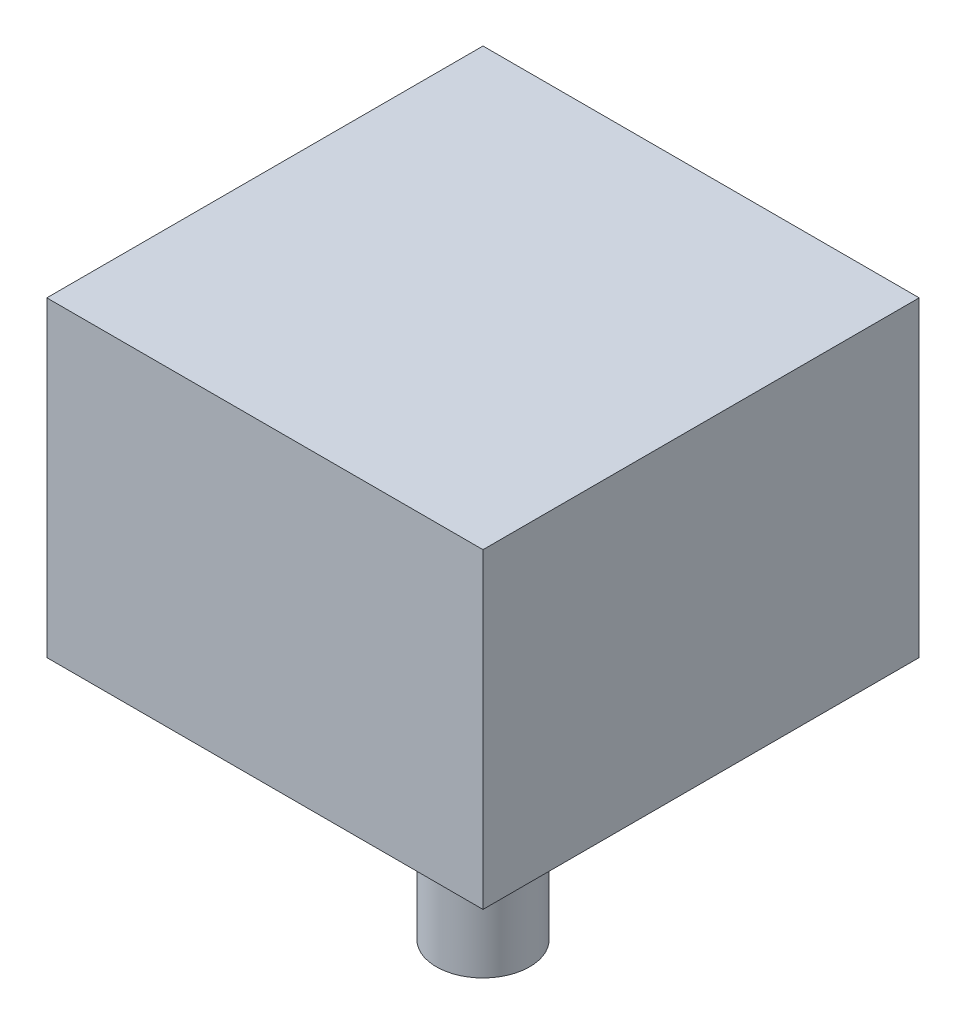
ISO-10303-21;
HEADER;
FILE_DESCRIPTION(('STEP AP214'),'2;1');
FILE_NAME('part.step','',(''),(''),'','','');
FILE_SCHEMA(('AUTOMOTIVE_DESIGN { 1 0 10303 214 1 1 1 1 }'));
ENDSEC;
DATA;
#1=APPLICATION_CONTEXT('core data for automotive mechanical design processes');
#2=APPLICATION_PROTOCOL_DEFINITION('international standard','automotive_design',2000,#1);
#3=PRODUCT_CONTEXT('',#1,'mechanical');
#4=PRODUCT('Part','Part','',(#3));
#5=PRODUCT_RELATED_PRODUCT_CATEGORY('part','',(#4));
#6=PRODUCT_DEFINITION_FORMATION('','',#4);
#7=PRODUCT_DEFINITION_CONTEXT('part definition',#1,'design');
#8=PRODUCT_DEFINITION('design','',#6,#7);
#9=PRODUCT_DEFINITION_SHAPE('','',#8);
#10=(LENGTH_UNIT() NAMED_UNIT(*) SI_UNIT(.MILLI.,.METRE.));
#11=(NAMED_UNIT(*) PLANE_ANGLE_UNIT() SI_UNIT($,.RADIAN.));
#12=(NAMED_UNIT(*) SI_UNIT($,.STERADIAN.) SOLID_ANGLE_UNIT());
#13=UNCERTAINTY_MEASURE_WITH_UNIT(LENGTH_MEASURE(1.E-05),#10,'distance_accuracy_value','');
#14=(GEOMETRIC_REPRESENTATION_CONTEXT(3) GLOBAL_UNCERTAINTY_ASSIGNED_CONTEXT((#13)) GLOBAL_UNIT_ASSIGNED_CONTEXT((#10,
#11,#12)) REPRESENTATION_CONTEXT('',''));
#15=CARTESIAN_POINT('',(0.,0.,0.));
#16=DIRECTION('',(0.,0.,1.));
#17=DIRECTION('',(1.,0.,0.));
#18=AXIS2_PLACEMENT_3D('',#15,#16,#17);
#19=CARTESIAN_POINT('',(0.,-7.7,0.));
#20=DIRECTION('',(0.,-1.,0.));
#21=DIRECTION('',(1.,0.,0.));
#22=AXIS2_PLACEMENT_3D('',#19,#20,#21);
#23=SPHERICAL_SURFACE('',#22,6.7);
#24=CARTESIAN_POINT('',(0.,-13.6908263203001,0.));
#25=DIRECTION('',(0.,-1.,0.));
#26=DIRECTION('',(0.,0.,-1.));
#27=AXIS2_PLACEMENT_3D('',#24,#25,#26);
#28=CIRCLE('',#27,3.);
#29=CARTESIAN_POINT('',(0.,-13.6908263203001,-3.));
#30=VERTEX_POINT('',#29);
#31=EDGE_CURVE('E59',#30,#30,#28,.T.);
#32=ORIENTED_EDGE('',*,*,#31,.F.);
#33=EDGE_LOOP('',(#32));
#34=FACE_BOUND('',#33,.T.);
#35=ADVANCED_FACE('F47',(#34),#23,.T.);
#36=CARTESIAN_POINT('',(0.,-25.6908263203001,0.));
#37=DIRECTION('',(0.,-1.,0.));
#38=DIRECTION('',(0.,0.,-1.));
#39=AXIS2_PLACEMENT_3D('',#36,#37,#38);
#40=PLANE('',#39);
#41=CARTESIAN_POINT('',(0.,-25.6908263203001,0.));
#42=DIRECTION('',(0.,-1.,0.));
#43=DIRECTION('',(0.,0.,-1.));
#44=AXIS2_PLACEMENT_3D('',#41,#42,#43);
#45=CIRCLE('',#44,3.);
#46=CARTESIAN_POINT('',(0.,-25.6908263203001,-3.));
#47=VERTEX_POINT('',#46);
#48=EDGE_CURVE('E11',#47,#47,#45,.T.);
#49=ORIENTED_EDGE('',*,*,#48,.T.);
#50=EDGE_LOOP('',(#49));
#51=FACE_BOUND('',#50,.T.);
#52=ADVANCED_FACE('F80',(#51),#40,.T.);
#53=CARTESIAN_POINT('',(0.,-15.,0.));
#54=DIRECTION('',(0.,-1.,0.));
#55=DIRECTION('',(0.,0.,-1.));
#56=AXIS2_PLACEMENT_3D('',#53,#54,#55);
#57=CYLINDRICAL_SURFACE('',#56,3.);
#58=CARTESIAN_POINT('',(0.,-16.1408263203001,-3.));
#59=CARTESIAN_POINT('',(0.0811571910938376,-16.1408315784001,-2.99999537089788));
#60=CARTESIAN_POINT('',(0.162401205175879,-16.1472376498135,-2.99667198613769));
#61=CARTESIAN_POINT('',(0.322467237501783,-16.1725687074318,-2.98370448048951));
#62=CARTESIAN_POINT('',(0.401284825199774,-16.1915153198787,-2.9740494408884));
#63=CARTESIAN_POINT('',(0.553942541484701,-16.2409779868097,-2.94942426610682));
#64=CARTESIAN_POINT('',(0.627801076270518,-16.2714481136881,-2.9344752452331));
#65=CARTESIAN_POINT('',(0.769236589542657,-16.3428437336996,-2.90061565038481));
#66=CARTESIAN_POINT('',(0.836813795276095,-16.3837688483892,-2.88170521980747));
#67=CARTESIAN_POINT('',(0.968580906882855,-16.4778491182442,-2.84023220948415));
#68=CARTESIAN_POINT('',(1.03228532788197,-16.5316146262331,-2.81751418971713));
#69=CARTESIAN_POINT('',(1.15022482176075,-16.6485272925223,-2.77146151785461));
#70=CARTESIAN_POINT('',(1.20445215024937,-16.7116820461635,-2.74812637922862));
#71=CARTESIAN_POINT('',(1.30648923081014,-16.8519436343399,-2.70120330313405));
#72=CARTESIAN_POINT('',(1.35337394091069,-16.9297775386207,-2.67775957207619));
#73=CARTESIAN_POINT('',(1.43319211235935,-17.0935490535029,-2.63590673492172));
#74=CARTESIAN_POINT('',(1.4661359906984,-17.1794805544303,-2.61749387327315));
#75=CARTESIAN_POINT('',(1.51491639840249,-17.351666556446,-2.58955215608188));
#76=CARTESIAN_POINT('',(1.53167906402741,-17.4375773151785,-2.57954726765549));
#77=CARTESIAN_POINT('',(1.5504322336963,-17.6115245904134,-2.56832510020633));
#78=CARTESIAN_POINT('',(1.55243922221982,-17.6995586244852,-2.56709801499814));
#79=CARTESIAN_POINT('',(1.54230129742961,-17.8629410322522,-2.57319253317738));
#80=CARTESIAN_POINT('',(1.53196008446953,-17.938452357995,-2.57942483011358));
#81=CARTESIAN_POINT('',(1.50056578834274,-18.0864629289671,-2.59781254539799));
#82=CARTESIAN_POINT('',(1.47950888000057,-18.1589610885852,-2.6099700788088));
#83=CARTESIAN_POINT('',(1.42692348053688,-18.3009559713401,-2.63909184292093));
#84=CARTESIAN_POINT('',(1.39516499725198,-18.3703451198932,-2.65616032364527));
#85=CARTESIAN_POINT('',(1.32226003328843,-18.5031524216957,-2.6931948900567));
#86=CARTESIAN_POINT('',(1.28110933978834,-18.5665678773925,-2.71316227456326));
#87=CARTESIAN_POINT('',(1.18404201316546,-18.6947480596858,-2.75703642460624));
#88=CARTESIAN_POINT('',(1.12687615066993,-18.7585135388794,-2.78110870294603));
#89=CARTESIAN_POINT('',(1.00260342432817,-18.8759854664302,-2.8282866964176));
#90=CARTESIAN_POINT('',(0.935491212511122,-18.9296864679051,-2.85139188293745));
#91=CARTESIAN_POINT('',(0.788777791303168,-19.0281874811507,-2.89551258123171));
#92=CARTESIAN_POINT('',(0.708704849471569,-19.0723693956328,-2.91635383715829));
#93=CARTESIAN_POINT('',(0.540916699103984,-19.1462615697336,-2.95207406352636));
#94=CARTESIAN_POINT('',(0.453208011588539,-19.1759840377028,-2.96695806189017));
#95=CARTESIAN_POINT('',(0.280760113824297,-19.2175375653729,-2.98798539660306));
#96=CARTESIAN_POINT('',(0.196419524160748,-19.2306930277411,-2.99477304114119));
#97=CARTESIAN_POINT('',(0.0264689022377681,-19.2429364497529,-3.0010855932881));
#98=CARTESIAN_POINT('',(-0.0591404421617313,-19.2420317721266,-3.00061430211088));
#99=CARTESIAN_POINT('',(-0.221539739201024,-19.2268960393847,-2.9928209898369));
#100=CARTESIAN_POINT('',(-0.298466661716922,-19.213790297324,-2.98607750557626));
#101=CARTESIAN_POINT('',(-0.448859357796646,-19.176434067703,-2.96719922421109));
#102=CARTESIAN_POINT('',(-0.522324759933459,-19.1521823871533,-2.95506384999814));
#103=CARTESIAN_POINT('',(-0.666024635549228,-19.0926555768419,-2.92607802762269));
#104=CARTESIAN_POINT('',(-0.736118511927176,-19.0571007556601,-2.90910922874945));
#105=CARTESIAN_POINT('',(-0.86956370361175,-18.9763031229062,-2.87204849519176));
#106=CARTESIAN_POINT('',(-0.932912233799398,-18.931056332613,-2.85195527881111));
#107=CARTESIAN_POINT('',(-1.05800428540772,-18.8267939255246,-2.80810596771983));
#108=CARTESIAN_POINT('',(-1.11890926475951,-18.7668397906343,-2.78418580334275));
#109=CARTESIAN_POINT('',(-1.23019970538266,-18.6376047465247,-2.73683648190065));
#110=CARTESIAN_POINT('',(-1.28057666580067,-18.5683163740387,-2.71340773525695));
#111=CARTESIAN_POINT('',(-1.37215429643325,-18.417406788807,-2.66832311402417));
#112=CARTESIAN_POINT('',(-1.41266019174362,-18.3353053536211,-2.64684681378419));
#113=CARTESIAN_POINT('',(-1.4788525492711,-18.1640029301725,-2.61044850074907));
#114=CARTESIAN_POINT('',(-1.50455924389598,-18.0748118252869,-2.59551754632325));
#115=CARTESIAN_POINT('',(-1.53795658358956,-17.9011301515311,-2.57585561622636));
#116=CARTESIAN_POINT('',(-1.54716011229659,-17.8170298301336,-2.57027169154));
#117=CARTESIAN_POINT('',(-1.55170937850173,-17.6483359522139,-2.56753016065378));
#118=CARTESIAN_POINT('',(-1.54706263561229,-17.5637426882118,-2.57036798210188));
#119=CARTESIAN_POINT('',(-1.52547998823504,-17.4061324502606,-2.58322181370145));
#120=CARTESIAN_POINT('',(-1.50992456690369,-17.332851456764,-2.59243003353327));
#121=CARTESIAN_POINT('',(-1.46875628196533,-17.1900460367817,-2.61597283092195));
#122=CARTESIAN_POINT('',(-1.4431399785158,-17.1205229043772,-2.63030916164385));
#123=CARTESIAN_POINT('',(-1.38069574346861,-16.9820769492414,-2.66364552397914));
#124=CARTESIAN_POINT('',(-1.34323674576593,-16.9134999521494,-2.68289185984042));
#125=CARTESIAN_POINT('',(-1.25883212591263,-16.7831489514886,-2.72351522679164));
#126=CARTESIAN_POINT('',(-1.21188143318073,-16.7213786114874,-2.74489339362581));
#127=CARTESIAN_POINT('',(-1.10252915226197,-16.5978461741074,-2.79076888465928));
#128=CARTESIAN_POINT('',(-1.03890355388211,-16.5371753489371,-2.81530328538766));
#129=CARTESIAN_POINT('',(-0.901768578594903,-16.4270837217072,-2.86217781867697));
#130=CARTESIAN_POINT('',(-0.82825343474561,-16.3776695294136,-2.88451665767506));
#131=CARTESIAN_POINT('',(-0.671719725833232,-16.291035957907,-2.9249654101906));
#132=CARTESIAN_POINT('',(-0.588575023094199,-16.25401085765,-2.94300677813279));
#133=CARTESIAN_POINT('',(-0.416117662102292,-16.1949650475153,-2.97227790496241));
#134=CARTESIAN_POINT('',(-0.326822800067342,-16.1729028965647,-2.9835264675003));
#135=CARTESIAN_POINT('',(-0.197111591221045,-16.1529015604763,-2.99377574755927));
#136=CARTESIAN_POINT('',(-0.157869893981268,-16.1483807381931,-2.99610282114017));
#137=CARTESIAN_POINT('',(-0.0790923446110301,-16.1423418000818,-2.99921609427245));
#138=CARTESIAN_POINT('',(-0.0395564853315003,-16.1408237574716,-3.00000225625121));
#139=CARTESIAN_POINT('',(0.,-16.1408263203001,-3.));
#140=B_SPLINE_CURVE_WITH_KNOTS('',3,(#58,#59,#60,#61,#62,#63,#64,#65,#66,#67,#68,#69,#70,#71,
#72,#73,#74,#75,#76,#77,#78,#79,#80,#81,#82,#83,#84,#85,#86,#87,#88,#89,#90,#91,#92,#93,#94,#95,
#96,#97,#98,#99,#100,#101,#102,#103,#104,#105,#106,#107,#108,#109,#110,#111,#112,#113,#114,#115,
#116,#117,#118,#119,#120,#121,#122,#123,#124,#125,#126,#127,#128,#129,#130,#131,#132,#133,#134,
#135,#136,#137,#138,#139),.UNSPECIFIED.,.T.,.F.,(4,2,2,2,2,2,2,2,2,2,2,2,2,2,2,2,2,2,2,2,2,2,2,
2,2,2,2,2,2,2,2,2,2,2,2,2,2,2,2,2,4),(0.,0.243311545013475,0.487043779368091,0.729814671205952,
0.972576776611061,1.23071170610758,1.48905659919067,1.76915795006661,2.04904962997784,
2.31175720064009,2.57417123976732,2.80251243731576,3.03093520292359,3.26461853987062,
3.49840690083491,3.76413445854403,4.03000541498387,4.30988543134837,4.58952872847072,
4.84500071457372,5.10033892477694,5.33423793340262,5.56816198289844,5.80839566718476,
6.0487281612101,6.31383394548568,6.57915296946552,6.85973810502119,7.13993872810776,
7.39280485418765,7.64553371878147,7.87098585035563,8.09651513181351,8.33700671665397,
8.57762711619527,8.85021371423121,9.12295996177134,9.39980216012752,9.67587445633209,
9.79446302206794,9.91305447935707),.UNSPECIFIED.);
#141=CARTESIAN_POINT('',(0.,-16.1408263203001,-3.));
#142=VERTEX_POINT('',#141);
#143=EDGE_CURVE('E50',#142,#142,#140,.T.);
#144=ORIENTED_EDGE('',*,*,#143,.F.);
#145=EDGE_LOOP('',(#144));
#146=FACE_BOUND('',#145,.T.);
#147=CARTESIAN_POINT('',(1.55,-17.6908263203001,2.56855990780827));
#148=CARTESIAN_POINT('',(1.54999407109245,-17.6104859775882,2.56856758763116));
#149=CARTESIAN_POINT('',(1.54371135922679,-17.5300539206836,2.57238737620073));
#150=CARTESIAN_POINT('',(1.51891671673704,-17.3716931416102,2.5870999252185));
#151=CARTESIAN_POINT('',(1.50038081787188,-17.2937696403022,2.59800654738097));
#152=CARTESIAN_POINT('',(1.45211552860033,-17.1430203142061,2.62528412383222));
#153=CARTESIAN_POINT('',(1.42244885556849,-17.0701685891811,2.64162440408013));
#154=CARTESIAN_POINT('',(1.35295628441986,-16.9304966107349,2.67787992722966));
#155=CARTESIAN_POINT('',(1.31312926854182,-16.8636770220176,2.69779556339244));
#156=CARTESIAN_POINT('',(1.22032197800243,-16.7314506693471,2.74110531727558));
#157=CARTESIAN_POINT('',(1.16649013086066,-16.666691083845,2.76465130044681));
#158=CARTESIAN_POINT('',(1.04896817557422,-16.5466109171583,2.81134587456851));
#159=CARTESIAN_POINT('',(0.985272888962598,-16.4912953264852,2.83449424963512));
#160=CARTESIAN_POINT('',(0.844142015762803,-16.3877030497506,2.87980949206864));
#161=CARTESIAN_POINT('',(0.766042002654875,-16.3402377698945,2.90178054660839));
#162=CARTESIAN_POINT('',(0.601616567282121,-16.2594173766043,2.94026618916116));
#163=CARTESIAN_POINT('',(0.515296729940619,-16.2260527651758,2.95678444844664));
#164=CARTESIAN_POINT('',(0.343751425344187,-16.1769953685768,2.98140398435746));
#165=CARTESIAN_POINT('',(0.258930938090316,-16.1601632621927,2.99004437442712));
#166=CARTESIAN_POINT('',(0.0872652452120801,-16.1408809614555,2.99995965106026));
#167=CARTESIAN_POINT('',(0.000421398649064729,-16.1384213778344,3.00123934620302));
#168=CARTESIAN_POINT('',(-0.164194325558729,-16.1475502962541,2.99653017783555));
#169=CARTESIAN_POINT('',(-0.242060863657692,-16.1578576056933,2.99120414963753));
#170=CARTESIAN_POINT('',(-0.39477526047954,-16.1899130742451,2.97490343836279));
#171=CARTESIAN_POINT('',(-0.469622891353697,-16.2116620951751,2.96392832978496));
#172=CARTESIAN_POINT('',(-0.615423392470294,-16.2660835758464,2.93714577929529));
#173=CARTESIAN_POINT('',(-0.686312903663804,-16.2988945028463,2.92127731120307));
#174=CARTESIAN_POINT('',(-0.821742168129233,-16.3742954917682,2.88611193920134));
#175=CARTESIAN_POINT('',(-0.886279697925966,-16.4168889607448,2.86681384135457));
#176=CARTESIAN_POINT('',(-1.01400407671659,-16.5154822176356,2.82431625347965));
#177=CARTESIAN_POINT('',(-1.07642304241976,-16.5723923466034,2.80091965725316));
#178=CARTESIAN_POINT('',(-1.19125978704577,-16.6955870464873,2.75404340345798));
#179=CARTESIAN_POINT('',(-1.24366896925665,-16.7618795910104,2.73056369197505));
#180=CARTESIAN_POINT('',(-1.34067598541859,-16.9076992203307,2.68433935057199));
#181=CARTESIAN_POINT('',(-1.38445282790692,-16.9878323239923,2.66176585737562));
#182=CARTESIAN_POINT('',(-1.45758159270672,-17.1557409990101,2.62244082990642));
#183=CARTESIAN_POINT('',(-1.48694930991728,-17.2435080773548,2.60568292666568));
#184=CARTESIAN_POINT('',(-1.52796614090751,-17.4167976207275,2.58182970365164));
#185=CARTESIAN_POINT('',(-1.54085224706871,-17.501931150139,2.57406462933598));
#186=CARTESIAN_POINT('',(-1.55227925919939,-17.6734752568523,2.56719372521464));
#187=CARTESIAN_POINT('',(-1.55083201076113,-17.7598847207085,2.56808074500258));
#188=CARTESIAN_POINT('',(-1.53476867977678,-17.9203837202708,2.57770145969977));
#189=CARTESIAN_POINT('',(-1.5217622123245,-17.9947020139428,2.58547570331481));
#190=CARTESIAN_POINT('',(-1.4853972952245,-18.1399391378141,2.60653659420377));
#191=CARTESIAN_POINT('',(-1.46203517760044,-18.2108567536198,2.61982519455895));
#192=CARTESIAN_POINT('',(-1.40452444849724,-18.350985584625,2.65111755303425));
#193=CARTESIAN_POINT('',(-1.36993220782627,-18.4199712003414,2.6693088295102));
#194=CARTESIAN_POINT('',(-1.29132141669978,-18.5515648172018,2.7082118952703));
#195=CARTESIAN_POINT('',(-1.24729801391975,-18.6141695108052,2.72892497964524));
#196=CARTESIAN_POINT('',(-1.14406942423122,-18.7401638747525,2.77392991563014));
#197=CARTESIAN_POINT('',(-1.08361254709366,-18.802496122439,2.79832457859212));
#198=CARTESIAN_POINT('',(-0.952771318472118,-18.9164927697787,2.84553409763736));
#199=CARTESIAN_POINT('',(-0.882382884381673,-18.9681527607145,2.86834829825403));
#200=CARTESIAN_POINT('',(-0.730528288923954,-19.0608618970158,2.91079728556098));
#201=CARTESIAN_POINT('',(-0.648769911698114,-19.1014973703954,2.93029988061539));
#202=CARTESIAN_POINT('',(-0.478280121236611,-19.1680192314852,2.96289604969122));
#203=CARTESIAN_POINT('',(-0.389555315148681,-19.1939194067716,2.97599561330176));
#204=CARTESIAN_POINT('',(-0.216791982566538,-19.2278681072883,2.99329389211888));
#205=CARTESIAN_POINT('',(-0.133114920491119,-19.2373850508053,2.99822306876511));
#206=CARTESIAN_POINT('',(0.0347780939831539,-19.2427074996484,3.00097103355683));
#207=CARTESIAN_POINT('',(0.118993816573318,-19.2385185075721,2.99879267520451));
#208=CARTESIAN_POINT('',(0.279050183963372,-19.2174791480057,2.98799243472546));
#209=CARTESIAN_POINT('',(0.355052230531945,-19.2015793984853,2.97985458335338));
#210=CARTESIAN_POINT('',(0.50316534216494,-19.1589090211882,2.95845010729966));
#211=CARTESIAN_POINT('',(0.575275881921464,-19.1321369299104,2.94518279216409));
#212=CARTESIAN_POINT('',(0.716866547546159,-19.0673833035484,2.9140301713442));
#213=CARTESIAN_POINT('',(0.786121316748202,-19.0289911170715,2.89597937073075));
#214=CARTESIAN_POINT('',(0.917477041476121,-18.9425944646975,2.85708525970917));
#215=CARTESIAN_POINT('',(0.979574760181064,-18.8945856762967,2.83624069494933));
#216=CARTESIAN_POINT('',(1.10175313447835,-18.7844876368745,2.79120242805909));
#217=CARTESIAN_POINT('',(1.16093514660659,-18.7214486448519,2.76688703009448));
#218=CARTESIAN_POINT('',(1.26825247015974,-18.5860927590577,2.71937285599714));
#219=CARTESIAN_POINT('',(1.31637683220899,-18.5137667787316,2.6961752044712));
#220=CARTESIAN_POINT('',(1.40202611396712,-18.3579526476469,2.65268352260283));
#221=CARTESIAN_POINT('',(1.439016674449,-18.2741217855475,2.6325537877284));
#222=CARTESIAN_POINT('',(1.49779119293291,-18.1000830709497,2.59957382501019));
#223=CARTESIAN_POINT('',(1.51962562830278,-18.0098974991438,2.5866994604253));
#224=CARTESIAN_POINT('',(1.53880267262315,-17.8806601474039,2.57528987108191));
#225=CARTESIAN_POINT('',(1.54299409011397,-17.8428675336644,2.57277665675291));
#226=CARTESIAN_POINT('',(1.54859424707795,-17.76699893935,2.56940980204656));
#227=CARTESIAN_POINT('',(1.55000281143116,-17.7289229410937,2.56855626610983));
#228=CARTESIAN_POINT('',(1.55,-17.6908263203001,2.56855990780827));
#229=B_SPLINE_CURVE_WITH_KNOTS('',3,(#147,#148,#149,#150,#151,#152,#153,#154,#155,#156,#157,
#158,#159,#160,#161,#162,#163,#164,#165,#166,#167,#168,#169,#170,#171,#172,#173,#174,#175,#176,
#177,#178,#179,#180,#181,#182,#183,#184,#185,#186,#187,#188,#189,#190,#191,#192,#193,#194,#195,
#196,#197,#198,#199,#200,#201,#202,#203,#204,#205,#206,#207,#208,#209,#210,#211,#212,#213,#214,
#215,#216,#217,#218,#219,#220,#221,#222,#223,#224,#225,#226,#227,#228),.UNSPECIFIED.,.T.,.F.,(4,
2,2,2,2,2,2,2,2,2,2,2,2,2,2,2,2,2,2,2,2,2,2,2,2,2,2,2,2,2,2,2,2,2,2,2,2,2,2,2,4),(0.,
0.240860404934378,0.48219335230399,0.722186424528838,0.962205910303522,1.2234452790249,
1.48482227062786,1.76532798576229,2.04564445422735,2.30490154317004,2.56398924593492,
2.7990581657298,3.03414479402262,3.27229068379531,3.51051964090497,3.7723607934912,
4.03442582200953,4.31513509274971,4.59553596615625,4.85334395290183,5.11093889578024,
5.33746018243238,5.56406176722676,5.80100537313768,6.03807118035938,6.30746891746102,
6.57697772141108,6.8555195369389,7.13380029500914,7.38550951502228,7.63711769235047,
7.87028238079253,8.1034784654127,8.34613400201953,8.58889885402428,8.85718985782794,
9.12574539156814,9.40565889084488,9.68463560847094,9.79884211828697,9.91305581468468),.UNSPECIFIED.);
#230=CARTESIAN_POINT('',(1.55,-17.6908263203001,2.56855990780827));
#231=VERTEX_POINT('',#230);
#232=EDGE_CURVE('E65',#231,#231,#229,.T.);
#233=ORIENTED_EDGE('',*,*,#232,.F.);
#234=EDGE_LOOP('',(#233));
#235=FACE_BOUND('',#234,.T.);
#236=ORIENTED_EDGE('',*,*,#31,.T.);
#237=EDGE_LOOP('',(#236));
#238=FACE_BOUND('',#237,.T.);
#239=ORIENTED_EDGE('',*,*,#48,.F.);
#240=EDGE_LOOP('',(#239));
#241=FACE_BOUND('',#240,.T.);
#242=ADVANCED_FACE('F70',(#146,#235,#238,#241),#57,.T.);
#243=CARTESIAN_POINT('',(0.,-17.6908263203001,-14.));
#244=DIRECTION('',(0.,0.,1.));
#245=DIRECTION('',(1.,0.,0.));
#246=AXIS2_PLACEMENT_3D('',#243,#244,#245);
#247=CYLINDRICAL_SURFACE('',#246,1.55);
#248=ORIENTED_EDGE('',*,*,#143,.T.);
#249=EDGE_LOOP('',(#248));
#250=FACE_BOUND('',#249,.T.);
#251=ORIENTED_EDGE('',*,*,#232,.T.);
#252=EDGE_LOOP('',(#251));
#253=FACE_BOUND('',#252,.T.);
#254=ADVANCED_FACE('F72',(#250,#253),#247,.F.);
#255=CLOSED_SHELL('',(#35,#52,#242,#254));
#256=MANIFOLD_SOLID_BREP('B2',#255);
#257=CARTESIAN_POINT('',(-14.,-10.,-14.));
#258=DIRECTION('',(-1.,0.,0.));
#259=DIRECTION('',(0.,0.,1.));
#260=AXIS2_PLACEMENT_3D('',#257,#258,#259);
#261=PLANE('',#260);
#262=DIRECTION('',(0.,0.,1.));
#263=VECTOR('',#262,1.);
#264=CARTESIAN_POINT('',(-14.,10.,-14.));
#265=LINE('',#264,#263);
#266=CARTESIAN_POINT('',(-14.,10.,-14.));
#267=VERTEX_POINT('',#266);
#268=CARTESIAN_POINT('',(-14.,10.,14.));
#269=VERTEX_POINT('',#268);
#270=EDGE_CURVE('E186',#267,#269,#265,.T.);
#271=ORIENTED_EDGE('',*,*,#270,.F.);
#272=DIRECTION('',(0.,1.,0.));
#273=VECTOR('',#272,1.);
#274=CARTESIAN_POINT('',(-14.,-10.,-14.));
#275=LINE('',#274,#273);
#276=CARTESIAN_POINT('',(-14.,-10.,-14.));
#277=VERTEX_POINT('',#276);
#278=EDGE_CURVE('E45',#277,#267,#275,.T.);
#279=ORIENTED_EDGE('',*,*,#278,.F.);
#280=DIRECTION('',(0.,0.,1.));
#281=VECTOR('',#280,1.);
#282=CARTESIAN_POINT('',(-14.,-10.,-14.));
#283=LINE('',#282,#281);
#284=CARTESIAN_POINT('',(-14.,-10.,14.));
#285=VERTEX_POINT('',#284);
#286=EDGE_CURVE('E181',#277,#285,#283,.T.);
#287=ORIENTED_EDGE('',*,*,#286,.T.);
#288=DIRECTION('',(0.,1.,0.));
#289=VECTOR('',#288,1.);
#290=CARTESIAN_POINT('',(-14.,-10.,14.));
#291=LINE('',#290,#289);
#292=EDGE_CURVE('E160',#285,#269,#291,.T.);
#293=ORIENTED_EDGE('',*,*,#292,.T.);
#294=EDGE_LOOP('',(#271,#279,#287,#293));
#295=FACE_BOUND('',#294,.T.);
#296=ADVANCED_FACE('F119',(#295),#261,.T.);
#297=CARTESIAN_POINT('',(-14.,-10.,-14.));
#298=DIRECTION('',(0.,0.,1.));
#299=DIRECTION('',(1.,0.,0.));
#300=AXIS2_PLACEMENT_3D('',#297,#298,#299);
#301=PLANE('',#300);
#302=DIRECTION('',(1.,0.,0.));
#303=VECTOR('',#302,1.);
#304=CARTESIAN_POINT('',(-14.,10.,-14.));
#305=LINE('',#304,#303);
#306=CARTESIAN_POINT('',(14.,10.,-14.));
#307=VERTEX_POINT('',#306);
#308=EDGE_CURVE('E152',#267,#307,#305,.T.);
#309=ORIENTED_EDGE('',*,*,#308,.T.);
#310=DIRECTION('',(0.,1.,0.));
#311=VECTOR('',#310,1.);
#312=CARTESIAN_POINT('',(14.,-10.,-14.));
#313=LINE('',#312,#311);
#314=CARTESIAN_POINT('',(14.,-10.,-14.));
#315=VERTEX_POINT('',#314);
#316=EDGE_CURVE('E128',#315,#307,#313,.T.);
#317=ORIENTED_EDGE('',*,*,#316,.F.);
#318=DIRECTION('',(1.,0.,0.));
#319=VECTOR('',#318,1.);
#320=CARTESIAN_POINT('',(-14.,-10.,-14.));
#321=LINE('',#320,#319);
#322=EDGE_CURVE('E170',#277,#315,#321,.T.);
#323=ORIENTED_EDGE('',*,*,#322,.F.);
#324=ORIENTED_EDGE('',*,*,#278,.T.);
#325=EDGE_LOOP('',(#309,#317,#323,#324));
#326=FACE_BOUND('',#325,.T.);
#327=ADVANCED_FACE('F208',(#326),#301,.F.);
#328=CARTESIAN_POINT('',(14.,-10.,-14.));
#329=DIRECTION('',(-1.,0.,0.));
#330=DIRECTION('',(0.,0.,1.));
#331=AXIS2_PLACEMENT_3D('',#328,#329,#330);
#332=PLANE('',#331);
#333=DIRECTION('',(0.,0.,1.));
#334=VECTOR('',#333,1.);
#335=CARTESIAN_POINT('',(14.,10.,-14.));
#336=LINE('',#335,#334);
#337=CARTESIAN_POINT('',(14.,10.,14.));
#338=VERTEX_POINT('',#337);
#339=EDGE_CURVE('E177',#307,#338,#336,.T.);
#340=ORIENTED_EDGE('',*,*,#339,.T.);
#341=DIRECTION('',(0.,1.,0.));
#342=VECTOR('',#341,1.);
#343=CARTESIAN_POINT('',(14.,-10.,14.));
#344=LINE('',#343,#342);
#345=CARTESIAN_POINT('',(14.,-10.,14.));
#346=VERTEX_POINT('',#345);
#347=EDGE_CURVE('E174',#346,#338,#344,.T.);
#348=ORIENTED_EDGE('',*,*,#347,.F.);
#349=DIRECTION('',(0.,0.,1.));
#350=VECTOR('',#349,1.);
#351=CARTESIAN_POINT('',(14.,-10.,-14.));
#352=LINE('',#351,#350);
#353=EDGE_CURVE('E165',#315,#346,#352,.T.);
#354=ORIENTED_EDGE('',*,*,#353,.F.);
#355=ORIENTED_EDGE('',*,*,#316,.T.);
#356=EDGE_LOOP('',(#340,#348,#354,#355));
#357=FACE_BOUND('',#356,.T.);
#358=ADVANCED_FACE('F175',(#357),#332,.F.);
#359=CARTESIAN_POINT('',(-14.,-10.,14.));
#360=DIRECTION('',(0.,0.,1.));
#361=DIRECTION('',(1.,0.,0.));
#362=AXIS2_PLACEMENT_3D('',#359,#360,#361);
#363=PLANE('',#362);
#364=DIRECTION('',(1.,0.,0.));
#365=VECTOR('',#364,1.);
#366=CARTESIAN_POINT('',(-14.,10.,14.));
#367=LINE('',#366,#365);
#368=EDGE_CURVE('E189',#269,#338,#367,.T.);
#369=ORIENTED_EDGE('',*,*,#368,.F.);
#370=ORIENTED_EDGE('',*,*,#292,.F.);
#371=DIRECTION('',(1.,0.,0.));
#372=VECTOR('',#371,1.);
#373=CARTESIAN_POINT('',(-14.,-10.,14.));
#374=LINE('',#373,#372);
#375=EDGE_CURVE('E169',#285,#346,#374,.T.);
#376=ORIENTED_EDGE('',*,*,#375,.T.);
#377=ORIENTED_EDGE('',*,*,#347,.T.);
#378=EDGE_LOOP('',(#369,#370,#376,#377));
#379=FACE_BOUND('',#378,.T.);
#380=ADVANCED_FACE('F180',(#379),#363,.T.);
#381=CARTESIAN_POINT('',(0.,-10.,0.));
#382=DIRECTION('',(0.,1.,0.));
#383=DIRECTION('',(0.,0.,1.));
#384=AXIS2_PLACEMENT_3D('',#381,#382,#383);
#385=PLANE('',#384);
#386=CARTESIAN_POINT('',(0.,-10.,0.));
#387=DIRECTION('',(0.,1.,0.));
#388=DIRECTION('',(0.,0.,1.));
#389=AXIS2_PLACEMENT_3D('',#386,#387,#388);
#390=CIRCLE('',#389,6.70820393249937);
#391=CARTESIAN_POINT('',(0.,-10.,6.70820393249937));
#392=VERTEX_POINT('',#391);
#393=EDGE_CURVE('E122',#392,#392,#390,.T.);
#394=ORIENTED_EDGE('',*,*,#393,.T.);
#395=EDGE_LOOP('',(#394));
#396=FACE_BOUND('',#395,.T.);
#397=ORIENTED_EDGE('',*,*,#286,.F.);
#398=ORIENTED_EDGE('',*,*,#322,.T.);
#399=ORIENTED_EDGE('',*,*,#353,.T.);
#400=ORIENTED_EDGE('',*,*,#375,.F.);
#401=EDGE_LOOP('',(#397,#398,#399,#400));
#402=FACE_BOUND('',#401,.T.);
#403=ADVANCED_FACE('F168',(#396,#402),#385,.F.);
#404=CARTESIAN_POINT('',(0.,10.,0.));
#405=DIRECTION('',(0.,1.,0.));
#406=DIRECTION('',(0.,0.,1.));
#407=AXIS2_PLACEMENT_3D('',#404,#405,#406);
#408=PLANE('',#407);
#409=ORIENTED_EDGE('',*,*,#270,.T.);
#410=ORIENTED_EDGE('',*,*,#368,.T.);
#411=ORIENTED_EDGE('',*,*,#339,.F.);
#412=ORIENTED_EDGE('',*,*,#308,.F.);
#413=EDGE_LOOP('',(#409,#410,#411,#412));
#414=FACE_BOUND('',#413,.T.);
#415=ADVANCED_FACE('F194',(#414),#408,.T.);
#416=CARTESIAN_POINT('',(0.,-8.,0.));
#417=DIRECTION('',(0.,-1.,0.));
#418=DIRECTION('',(-1.,0.,0.));
#419=AXIS2_PLACEMENT_3D('',#416,#417,#418);
#420=SPHERICAL_SURFACE('',#419,7.);
#421=ORIENTED_EDGE('',*,*,#393,.F.);
#422=EDGE_LOOP('',(#421));
#423=FACE_BOUND('',#422,.T.);
#424=ADVANCED_FACE('F196',(#423),#420,.F.);
#425=CLOSED_SHELL('',(#296,#327,#358,#380,#403,#415,#424));
#426=MANIFOLD_SOLID_BREP('B6',#425);
#427=ADVANCED_BREP_SHAPE_REPRESENTATION('',(#18,#256,#426),#14);
#428=SHAPE_DEFINITION_REPRESENTATION(#9,#427);
ENDSEC;
END-ISO-10303-21;
